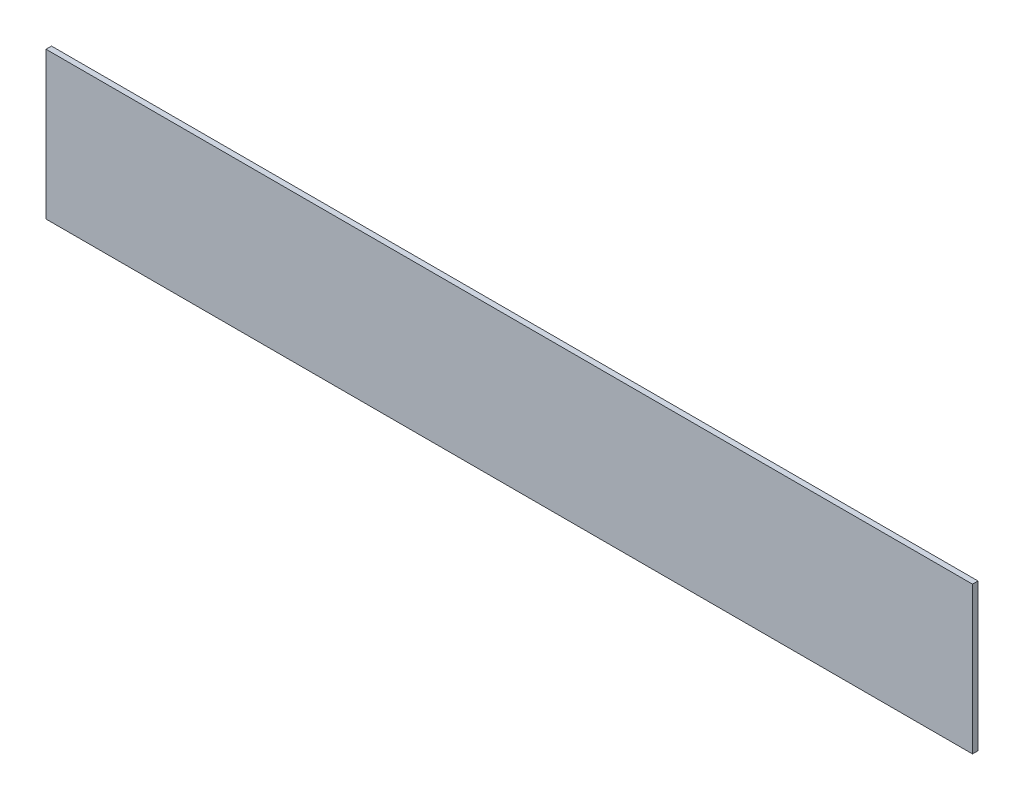
ISO-10303-21;
HEADER;
FILE_DESCRIPTION(('STEP AP214'),'2;1');
FILE_NAME('part.step','',(''),(''),'','','');
FILE_SCHEMA(('AUTOMOTIVE_DESIGN { 1 0 10303 214 1 1 1 1 }'));
ENDSEC;
DATA;
#1=APPLICATION_CONTEXT('core data for automotive mechanical design processes');
#2=APPLICATION_PROTOCOL_DEFINITION('international standard','automotive_design',2000,#1);
#3=PRODUCT_CONTEXT('',#1,'mechanical');
#4=PRODUCT('Part','Part','',(#3));
#5=PRODUCT_RELATED_PRODUCT_CATEGORY('part','',(#4));
#6=PRODUCT_DEFINITION_FORMATION('','',#4);
#7=PRODUCT_DEFINITION_CONTEXT('part definition',#1,'design');
#8=PRODUCT_DEFINITION('design','',#6,#7);
#9=PRODUCT_DEFINITION_SHAPE('','',#8);
#10=(LENGTH_UNIT() NAMED_UNIT(*) SI_UNIT(.MILLI.,.METRE.));
#11=(NAMED_UNIT(*) PLANE_ANGLE_UNIT() SI_UNIT($,.RADIAN.));
#12=(NAMED_UNIT(*) SI_UNIT($,.STERADIAN.) SOLID_ANGLE_UNIT());
#13=UNCERTAINTY_MEASURE_WITH_UNIT(LENGTH_MEASURE(1.E-05),#10,'distance_accuracy_value','');
#14=(GEOMETRIC_REPRESENTATION_CONTEXT(3) GLOBAL_UNCERTAINTY_ASSIGNED_CONTEXT((#13)) GLOBAL_UNIT_ASSIGNED_CONTEXT((#10,
#11,#12)) REPRESENTATION_CONTEXT('',''));
#15=CARTESIAN_POINT('',(0.,0.,0.));
#16=DIRECTION('',(0.,0.,1.));
#17=DIRECTION('',(1.,0.,0.));
#18=AXIS2_PLACEMENT_3D('',#15,#16,#17);
#19=CARTESIAN_POINT('',(252.,40.,3.));
#20=DIRECTION('',(-1.,0.,0.));
#21=DIRECTION('',(0.,0.,1.));
#22=AXIS2_PLACEMENT_3D('',#19,#20,#21);
#23=PLANE('',#22);
#24=DIRECTION('',(0.,1.,0.));
#25=VECTOR('',#24,1.);
#26=CARTESIAN_POINT('',(252.,40.,0.));
#27=LINE('',#26,#25);
#28=CARTESIAN_POINT('',(252.,-40.,0.));
#29=VERTEX_POINT('',#28);
#30=CARTESIAN_POINT('',(252.,40.,0.));
#31=VERTEX_POINT('',#30);
#32=EDGE_CURVE('E96',#29,#31,#27,.T.);
#33=ORIENTED_EDGE('',*,*,#32,.T.);
#34=DIRECTION('',(0.,0.,-1.));
#35=VECTOR('',#34,1.);
#36=CARTESIAN_POINT('',(252.,40.,3.));
#37=LINE('',#36,#35);
#38=CARTESIAN_POINT('',(252.,40.,3.));
#39=VERTEX_POINT('',#38);
#40=EDGE_CURVE('E11',#39,#31,#37,.T.);
#41=ORIENTED_EDGE('',*,*,#40,.F.);
#42=DIRECTION('',(0.,1.,0.));
#43=VECTOR('',#42,1.);
#44=CARTESIAN_POINT('',(252.,40.,3.));
#45=LINE('',#44,#43);
#46=CARTESIAN_POINT('',(252.,-40.,3.));
#47=VERTEX_POINT('',#46);
#48=EDGE_CURVE('E84',#47,#39,#45,.T.);
#49=ORIENTED_EDGE('',*,*,#48,.F.);
#50=DIRECTION('',(0.,0.,-1.));
#51=VECTOR('',#50,1.);
#52=CARTESIAN_POINT('',(252.,-40.,3.));
#53=LINE('',#52,#51);
#54=EDGE_CURVE('E92',#47,#29,#53,.T.);
#55=ORIENTED_EDGE('',*,*,#54,.T.);
#56=EDGE_LOOP('',(#33,#41,#49,#55));
#57=FACE_BOUND('',#56,.T.);
#58=ADVANCED_FACE('F33',(#57),#23,.F.);
#59=CARTESIAN_POINT('',(-252.,40.,3.));
#60=DIRECTION('',(0.,-1.,0.));
#61=DIRECTION('',(0.,0.,-1.));
#62=AXIS2_PLACEMENT_3D('',#59,#60,#61);
#63=PLANE('',#62);
#64=DIRECTION('',(-1.,0.,0.));
#65=VECTOR('',#64,1.);
#66=CARTESIAN_POINT('',(-252.,40.,0.));
#67=LINE('',#66,#65);
#68=CARTESIAN_POINT('',(-252.,40.,0.));
#69=VERTEX_POINT('',#68);
#70=EDGE_CURVE('E88',#31,#69,#67,.T.);
#71=ORIENTED_EDGE('',*,*,#70,.T.);
#72=DIRECTION('',(0.,0.,-1.));
#73=VECTOR('',#72,1.);
#74=CARTESIAN_POINT('',(-252.,40.,3.));
#75=LINE('',#74,#73);
#76=CARTESIAN_POINT('',(-252.,40.,3.));
#77=VERTEX_POINT('',#76);
#78=EDGE_CURVE('E41',#77,#69,#75,.T.);
#79=ORIENTED_EDGE('',*,*,#78,.F.);
#80=DIRECTION('',(-1.,0.,0.));
#81=VECTOR('',#80,1.);
#82=CARTESIAN_POINT('',(-252.,40.,3.));
#83=LINE('',#82,#81);
#84=EDGE_CURVE('E79',#39,#77,#83,.T.);
#85=ORIENTED_EDGE('',*,*,#84,.F.);
#86=ORIENTED_EDGE('',*,*,#40,.T.);
#87=EDGE_LOOP('',(#71,#79,#85,#86));
#88=FACE_BOUND('',#87,.T.);
#89=ADVANCED_FACE('F87',(#88),#63,.F.);
#90=CARTESIAN_POINT('',(-252.,40.,3.));
#91=DIRECTION('',(1.,0.,0.));
#92=DIRECTION('',(0.,0.,-1.));
#93=AXIS2_PLACEMENT_3D('',#90,#91,#92);
#94=PLANE('',#93);
#95=DIRECTION('',(0.,-1.,0.));
#96=VECTOR('',#95,1.);
#97=CARTESIAN_POINT('',(-252.,40.,0.));
#98=LINE('',#97,#96);
#99=CARTESIAN_POINT('',(-252.,-40.,0.));
#100=VERTEX_POINT('',#99);
#101=EDGE_CURVE('E66',#69,#100,#98,.T.);
#102=ORIENTED_EDGE('',*,*,#101,.T.);
#103=DIRECTION('',(0.,0.,-1.));
#104=VECTOR('',#103,1.);
#105=CARTESIAN_POINT('',(-252.,-40.,3.));
#106=LINE('',#105,#104);
#107=CARTESIAN_POINT('',(-252.,-40.,3.));
#108=VERTEX_POINT('',#107);
#109=EDGE_CURVE('E89',#108,#100,#106,.T.);
#110=ORIENTED_EDGE('',*,*,#109,.F.);
#111=DIRECTION('',(0.,-1.,0.));
#112=VECTOR('',#111,1.);
#113=CARTESIAN_POINT('',(-252.,40.,3.));
#114=LINE('',#113,#112);
#115=EDGE_CURVE('E82',#77,#108,#114,.T.);
#116=ORIENTED_EDGE('',*,*,#115,.F.);
#117=ORIENTED_EDGE('',*,*,#78,.T.);
#118=EDGE_LOOP('',(#102,#110,#116,#117));
#119=FACE_BOUND('',#118,.T.);
#120=ADVANCED_FACE('F90',(#119),#94,.F.);
#121=CARTESIAN_POINT('',(-252.,-40.,3.));
#122=DIRECTION('',(0.,1.,0.));
#123=DIRECTION('',(0.,0.,1.));
#124=AXIS2_PLACEMENT_3D('',#121,#122,#123);
#125=PLANE('',#124);
#126=DIRECTION('',(1.,0.,0.));
#127=VECTOR('',#126,1.);
#128=CARTESIAN_POINT('',(-252.,-40.,0.));
#129=LINE('',#128,#127);
#130=EDGE_CURVE('E72',#100,#29,#129,.T.);
#131=ORIENTED_EDGE('',*,*,#130,.T.);
#132=ORIENTED_EDGE('',*,*,#54,.F.);
#133=DIRECTION('',(1.,0.,0.));
#134=VECTOR('',#133,1.);
#135=CARTESIAN_POINT('',(-252.,-40.,3.));
#136=LINE('',#135,#134);
#137=EDGE_CURVE('E49',#108,#47,#136,.T.);
#138=ORIENTED_EDGE('',*,*,#137,.F.);
#139=ORIENTED_EDGE('',*,*,#109,.T.);
#140=EDGE_LOOP('',(#131,#132,#138,#139));
#141=FACE_BOUND('',#140,.T.);
#142=ADVANCED_FACE('F103',(#141),#125,.F.);
#143=CARTESIAN_POINT('',(0.,0.,3.));
#144=DIRECTION('',(0.,0.,1.));
#145=DIRECTION('',(1.,0.,0.));
#146=AXIS2_PLACEMENT_3D('',#143,#144,#145);
#147=PLANE('',#146);
#148=ORIENTED_EDGE('',*,*,#48,.T.);
#149=ORIENTED_EDGE('',*,*,#84,.T.);
#150=ORIENTED_EDGE('',*,*,#115,.T.);
#151=ORIENTED_EDGE('',*,*,#137,.T.);
#152=EDGE_LOOP('',(#148,#149,#150,#151));
#153=FACE_BOUND('',#152,.T.);
#154=ADVANCED_FACE('F80',(#153),#147,.T.);
#155=CARTESIAN_POINT('',(0.,0.,0.));
#156=DIRECTION('',(0.,0.,1.));
#157=DIRECTION('',(1.,0.,0.));
#158=AXIS2_PLACEMENT_3D('',#155,#156,#157);
#159=PLANE('',#158);
#160=ORIENTED_EDGE('',*,*,#32,.F.);
#161=ORIENTED_EDGE('',*,*,#130,.F.);
#162=ORIENTED_EDGE('',*,*,#101,.F.);
#163=ORIENTED_EDGE('',*,*,#70,.F.);
#164=EDGE_LOOP('',(#160,#161,#162,#163));
#165=FACE_BOUND('',#164,.T.);
#166=ADVANCED_FACE('F106',(#165),#159,.F.);
#167=CLOSED_SHELL('',(#58,#89,#120,#142,#154,#166));
#168=MANIFOLD_SOLID_BREP('B2',#167);
#169=ADVANCED_BREP_SHAPE_REPRESENTATION('',(#18,#168),#14);
#170=SHAPE_DEFINITION_REPRESENTATION(#9,#169);
ENDSEC;
END-ISO-10303-21;
